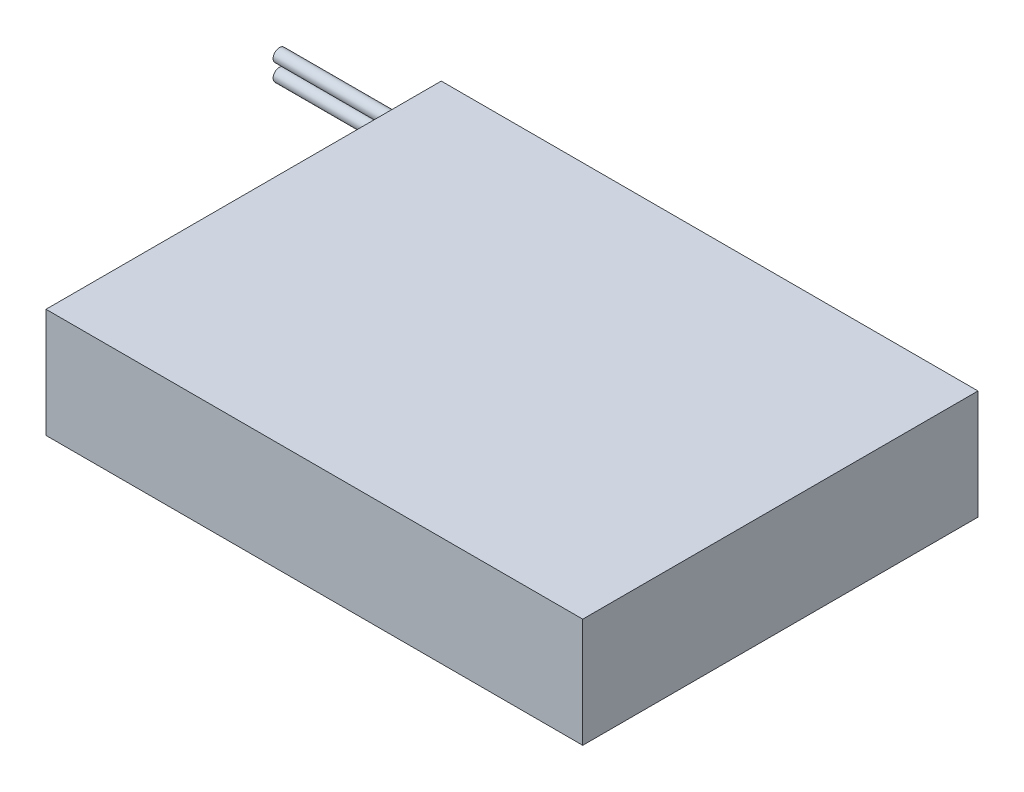
ISO-10303-21;
HEADER;
FILE_DESCRIPTION(('STEP AP214'),'2;1');
FILE_NAME('part.step','',(''),(''),'','','');
FILE_SCHEMA(('AUTOMOTIVE_DESIGN { 1 0 10303 214 1 1 1 1 }'));
ENDSEC;
DATA;
#1=APPLICATION_CONTEXT('core data for automotive mechanical design processes');
#2=APPLICATION_PROTOCOL_DEFINITION('international standard','automotive_design',2000,#1);
#3=PRODUCT_CONTEXT('',#1,'mechanical');
#4=PRODUCT('Part','Part','',(#3));
#5=PRODUCT_RELATED_PRODUCT_CATEGORY('part','',(#4));
#6=PRODUCT_DEFINITION_FORMATION('','',#4);
#7=PRODUCT_DEFINITION_CONTEXT('part definition',#1,'design');
#8=PRODUCT_DEFINITION('design','',#6,#7);
#9=PRODUCT_DEFINITION_SHAPE('','',#8);
#10=(LENGTH_UNIT() NAMED_UNIT(*) SI_UNIT(.MILLI.,.METRE.));
#11=(NAMED_UNIT(*) PLANE_ANGLE_UNIT() SI_UNIT($,.RADIAN.));
#12=(NAMED_UNIT(*) SI_UNIT($,.STERADIAN.) SOLID_ANGLE_UNIT());
#13=UNCERTAINTY_MEASURE_WITH_UNIT(LENGTH_MEASURE(1.E-05),#10,'distance_accuracy_value','');
#14=(GEOMETRIC_REPRESENTATION_CONTEXT(3) GLOBAL_UNCERTAINTY_ASSIGNED_CONTEXT((#13)) GLOBAL_UNIT_ASSIGNED_CONTEXT((#10,
#11,#12)) REPRESENTATION_CONTEXT('',''));
#15=CARTESIAN_POINT('',(0.,0.,0.));
#16=DIRECTION('',(0.,0.,1.));
#17=DIRECTION('',(1.,0.,0.));
#18=AXIS2_PLACEMENT_3D('',#15,#16,#17);
#19=CARTESIAN_POINT('',(-35.85,7.3,-26.4));
#20=DIRECTION('',(1.,0.,0.));
#21=DIRECTION('',(0.,0.,-1.));
#22=AXIS2_PLACEMENT_3D('',#19,#20,#21);
#23=PLANE('',#22);
#24=CARTESIAN_POINT('',(-35.85,-1.1365538511285,-24.7876982769878));
#25=DIRECTION('',(1.,0.,0.));
#26=DIRECTION('',(0.,0.,-1.));
#27=AXIS2_PLACEMENT_3D('',#24,#25,#26);
#28=CIRCLE('',#27,0.85);
#29=CARTESIAN_POINT('',(-35.85,-1.1365538511285,-25.6376982769877));
#30=VERTEX_POINT('',#29);
#31=EDGE_CURVE('E11',#30,#30,#28,.F.);
#32=ORIENTED_EDGE('',*,*,#31,.F.);
#33=EDGE_LOOP('',(#32));
#34=FACE_BOUND('',#33,.T.);
#35=CARTESIAN_POINT('',(-35.85,1.1365538511285,-24.7876982769878));
#36=DIRECTION('',(1.,0.,0.));
#37=DIRECTION('',(0.,0.,-1.));
#38=AXIS2_PLACEMENT_3D('',#35,#36,#37);
#39=CIRCLE('',#38,0.85);
#40=CARTESIAN_POINT('',(-35.85,1.1365538511285,-25.6376982769877));
#41=VERTEX_POINT('',#40);
#42=EDGE_CURVE('E43',#41,#41,#39,.F.);
#43=ORIENTED_EDGE('',*,*,#42,.F.);
#44=EDGE_LOOP('',(#43));
#45=FACE_BOUND('',#44,.T.);
#46=DIRECTION('',(0.,0.,1.));
#47=VECTOR('',#46,1.);
#48=CARTESIAN_POINT('',(-35.85,-7.3,-26.4));
#49=LINE('',#48,#47);
#50=CARTESIAN_POINT('',(-35.85,-7.3,-26.4));
#51=VERTEX_POINT('',#50);
#52=CARTESIAN_POINT('',(-35.85,-7.3,26.4));
#53=VERTEX_POINT('',#52);
#54=EDGE_CURVE('E102',#51,#53,#49,.T.);
#55=ORIENTED_EDGE('',*,*,#54,.T.);
#56=DIRECTION('',(0.,-1.,0.));
#57=VECTOR('',#56,1.);
#58=CARTESIAN_POINT('',(-35.85,7.3,26.4));
#59=LINE('',#58,#57);
#60=CARTESIAN_POINT('',(-35.85,7.3,26.4));
#61=VERTEX_POINT('',#60);
#62=EDGE_CURVE('E93',#61,#53,#59,.T.);
#63=ORIENTED_EDGE('',*,*,#62,.F.);
#64=DIRECTION('',(0.,0.,1.));
#65=VECTOR('',#64,1.);
#66=CARTESIAN_POINT('',(-35.85,7.3,-26.4));
#67=LINE('',#66,#65);
#68=CARTESIAN_POINT('',(-35.85,7.3,-26.4));
#69=VERTEX_POINT('',#68);
#70=EDGE_CURVE('E87',#69,#61,#67,.T.);
#71=ORIENTED_EDGE('',*,*,#70,.F.);
#72=DIRECTION('',(0.,-1.,0.));
#73=VECTOR('',#72,1.);
#74=CARTESIAN_POINT('',(-35.85,7.3,-26.4));
#75=LINE('',#74,#73);
#76=EDGE_CURVE('E98',#69,#51,#75,.T.);
#77=ORIENTED_EDGE('',*,*,#76,.T.);
#78=EDGE_LOOP('',(#55,#63,#71,#77));
#79=FACE_BOUND('',#78,.T.);
#80=ADVANCED_FACE('F35',(#34,#45,#79),#23,.F.);
#81=CARTESIAN_POINT('',(-35.85,7.3,26.4));
#82=DIRECTION('',(0.,0.,-1.));
#83=DIRECTION('',(-1.,0.,0.));
#84=AXIS2_PLACEMENT_3D('',#81,#82,#83);
#85=PLANE('',#84);
#86=DIRECTION('',(1.,0.,0.));
#87=VECTOR('',#86,1.);
#88=CARTESIAN_POINT('',(-35.85,-7.3,26.4));
#89=LINE('',#88,#87);
#90=CARTESIAN_POINT('',(35.85,-7.3,26.4));
#91=VERTEX_POINT('',#90);
#92=EDGE_CURVE('E92',#53,#91,#89,.T.);
#93=ORIENTED_EDGE('',*,*,#92,.T.);
#94=DIRECTION('',(0.,-1.,0.));
#95=VECTOR('',#94,1.);
#96=CARTESIAN_POINT('',(35.85,7.3,26.4));
#97=LINE('',#96,#95);
#98=CARTESIAN_POINT('',(35.85,7.3,26.4));
#99=VERTEX_POINT('',#98);
#100=EDGE_CURVE('E90',#99,#91,#97,.T.);
#101=ORIENTED_EDGE('',*,*,#100,.F.);
#102=DIRECTION('',(1.,0.,0.));
#103=VECTOR('',#102,1.);
#104=CARTESIAN_POINT('',(-35.85,7.3,26.4));
#105=LINE('',#104,#103);
#106=EDGE_CURVE('E82',#61,#99,#105,.T.);
#107=ORIENTED_EDGE('',*,*,#106,.F.);
#108=ORIENTED_EDGE('',*,*,#62,.T.);
#109=EDGE_LOOP('',(#93,#101,#107,#108));
#110=FACE_BOUND('',#109,.T.);
#111=ADVANCED_FACE('F91',(#110),#85,.F.);
#112=CARTESIAN_POINT('',(35.85,7.3,-26.4));
#113=DIRECTION('',(-1.,0.,0.));
#114=DIRECTION('',(0.,0.,1.));
#115=AXIS2_PLACEMENT_3D('',#112,#113,#114);
#116=PLANE('',#115);
#117=DIRECTION('',(0.,0.,-1.));
#118=VECTOR('',#117,1.);
#119=CARTESIAN_POINT('',(35.85,-7.3,-26.4));
#120=LINE('',#119,#118);
#121=CARTESIAN_POINT('',(35.85,-7.3,-26.4));
#122=VERTEX_POINT('',#121);
#123=EDGE_CURVE('E68',#91,#122,#120,.T.);
#124=ORIENTED_EDGE('',*,*,#123,.T.);
#125=DIRECTION('',(0.,-1.,0.));
#126=VECTOR('',#125,1.);
#127=CARTESIAN_POINT('',(35.85,7.3,-26.4));
#128=LINE('',#127,#126);
#129=CARTESIAN_POINT('',(35.85,7.3,-26.4));
#130=VERTEX_POINT('',#129);
#131=EDGE_CURVE('E94',#130,#122,#128,.T.);
#132=ORIENTED_EDGE('',*,*,#131,.F.);
#133=DIRECTION('',(0.,0.,-1.));
#134=VECTOR('',#133,1.);
#135=CARTESIAN_POINT('',(35.85,7.3,-26.4));
#136=LINE('',#135,#134);
#137=EDGE_CURVE('E85',#99,#130,#136,.T.);
#138=ORIENTED_EDGE('',*,*,#137,.F.);
#139=ORIENTED_EDGE('',*,*,#100,.T.);
#140=EDGE_LOOP('',(#124,#132,#138,#139));
#141=FACE_BOUND('',#140,.T.);
#142=ADVANCED_FACE('F96',(#141),#116,.F.);
#143=CARTESIAN_POINT('',(-35.85,7.3,-26.4));
#144=DIRECTION('',(0.,0.,1.));
#145=DIRECTION('',(1.,0.,0.));
#146=AXIS2_PLACEMENT_3D('',#143,#144,#145);
#147=PLANE('',#146);
#148=DIRECTION('',(-1.,0.,0.));
#149=VECTOR('',#148,1.);
#150=CARTESIAN_POINT('',(-35.85,-7.3,-26.4));
#151=LINE('',#150,#149);
#152=EDGE_CURVE('E74',#122,#51,#151,.T.);
#153=ORIENTED_EDGE('',*,*,#152,.T.);
#154=ORIENTED_EDGE('',*,*,#76,.F.);
#155=DIRECTION('',(-1.,0.,0.));
#156=VECTOR('',#155,1.);
#157=CARTESIAN_POINT('',(-35.85,7.3,-26.4));
#158=LINE('',#157,#156);
#159=EDGE_CURVE('E51',#130,#69,#158,.T.);
#160=ORIENTED_EDGE('',*,*,#159,.F.);
#161=ORIENTED_EDGE('',*,*,#131,.T.);
#162=EDGE_LOOP('',(#153,#154,#160,#161));
#163=FACE_BOUND('',#162,.T.);
#164=ADVANCED_FACE('F131',(#163),#147,.F.);
#165=CARTESIAN_POINT('',(0.,7.3,0.));
#166=DIRECTION('',(0.,1.,0.));
#167=DIRECTION('',(0.,0.,1.));
#168=AXIS2_PLACEMENT_3D('',#165,#166,#167);
#169=PLANE('',#168);
#170=ORIENTED_EDGE('',*,*,#70,.T.);
#171=ORIENTED_EDGE('',*,*,#106,.T.);
#172=ORIENTED_EDGE('',*,*,#137,.T.);
#173=ORIENTED_EDGE('',*,*,#159,.T.);
#174=EDGE_LOOP('',(#170,#171,#172,#173));
#175=FACE_BOUND('',#174,.T.);
#176=ADVANCED_FACE('F83',(#175),#169,.T.);
#177=CARTESIAN_POINT('',(0.,-7.3,0.));
#178=DIRECTION('',(0.,1.,0.));
#179=DIRECTION('',(0.,0.,1.));
#180=AXIS2_PLACEMENT_3D('',#177,#178,#179);
#181=PLANE('',#180);
#182=ORIENTED_EDGE('',*,*,#54,.F.);
#183=ORIENTED_EDGE('',*,*,#152,.F.);
#184=ORIENTED_EDGE('',*,*,#123,.F.);
#185=ORIENTED_EDGE('',*,*,#92,.F.);
#186=EDGE_LOOP('',(#182,#183,#184,#185));
#187=FACE_BOUND('',#186,.T.);
#188=ADVANCED_FACE('F121',(#187),#181,.F.);
#189=CARTESIAN_POINT('',(-55.85,1.1365538511285,-24.7876982769878));
#190=DIRECTION('',(1.,0.,0.));
#191=DIRECTION('',(0.,0.,-1.));
#192=AXIS2_PLACEMENT_3D('',#189,#190,#191);
#193=CYLINDRICAL_SURFACE('',#192,0.85);
#194=CARTESIAN_POINT('',(-55.85,1.1365538511285,-24.7876982769878));
#195=DIRECTION('',(-1.,0.,0.));
#196=DIRECTION('',(0.,0.,1.));
#197=AXIS2_PLACEMENT_3D('',#194,#195,#196);
#198=CIRCLE('',#197,0.85);
#199=CARTESIAN_POINT('',(-55.85,1.1365538511285,-23.9376982769877));
#200=VERTEX_POINT('',#199);
#201=EDGE_CURVE('E105',#200,#200,#198,.T.);
#202=ORIENTED_EDGE('',*,*,#201,.F.);
#203=EDGE_LOOP('',(#202));
#204=FACE_BOUND('',#203,.T.);
#205=ORIENTED_EDGE('',*,*,#42,.T.);
#206=EDGE_LOOP('',(#205));
#207=FACE_BOUND('',#206,.T.);
#208=ADVANCED_FACE('F114',(#204,#207),#193,.T.);
#209=CARTESIAN_POINT('',(-55.85,1.1365538511285,-24.7876982769878));
#210=DIRECTION('',(-1.,0.,0.));
#211=DIRECTION('',(0.,0.,1.));
#212=AXIS2_PLACEMENT_3D('',#209,#210,#211);
#213=PLANE('',#212);
#214=ORIENTED_EDGE('',*,*,#201,.T.);
#215=EDGE_LOOP('',(#214));
#216=FACE_BOUND('',#215,.T.);
#217=ADVANCED_FACE('F128',(#216),#213,.T.);
#218=CARTESIAN_POINT('',(-55.85,-1.1365538511285,-24.7876982769878));
#219=DIRECTION('',(1.,0.,0.));
#220=DIRECTION('',(0.,0.,-1.));
#221=AXIS2_PLACEMENT_3D('',#218,#219,#220);
#222=CYLINDRICAL_SURFACE('',#221,0.85);
#223=CARTESIAN_POINT('',(-55.85,-1.1365538511285,-24.7876982769878));
#224=DIRECTION('',(-1.,0.,0.));
#225=DIRECTION('',(0.,0.,-1.));
#226=AXIS2_PLACEMENT_3D('',#223,#224,#225);
#227=CIRCLE('',#226,0.85);
#228=CARTESIAN_POINT('',(-55.85,-1.1365538511285,-25.6376982769877));
#229=VERTEX_POINT('',#228);
#230=EDGE_CURVE('E211',#229,#229,#227,.T.);
#231=ORIENTED_EDGE('',*,*,#230,.F.);
#232=EDGE_LOOP('',(#231));
#233=FACE_BOUND('',#232,.T.);
#234=ORIENTED_EDGE('',*,*,#31,.T.);
#235=EDGE_LOOP('',(#234));
#236=FACE_BOUND('',#235,.T.);
#237=ADVANCED_FACE('F179',(#233,#236),#222,.T.);
#238=CARTESIAN_POINT('',(-55.85,-1.1365538511285,-24.7876982769878));
#239=DIRECTION('',(1.,0.,0.));
#240=DIRECTION('',(0.,0.,-1.));
#241=AXIS2_PLACEMENT_3D('',#238,#239,#240);
#242=PLANE('',#241);
#243=ORIENTED_EDGE('',*,*,#230,.T.);
#244=EDGE_LOOP('',(#243));
#245=FACE_BOUND('',#244,.T.);
#246=ADVANCED_FACE('F190',(#245),#242,.F.);
#247=CLOSED_SHELL('',(#80,#111,#142,#164,#176,#188,#208,#217,#237,#246));
#248=MANIFOLD_SOLID_BREP('B2',#247);
#249=ADVANCED_BREP_SHAPE_REPRESENTATION('',(#18,#248),#14);
#250=SHAPE_DEFINITION_REPRESENTATION(#9,#249);
ENDSEC;
END-ISO-10303-21;
